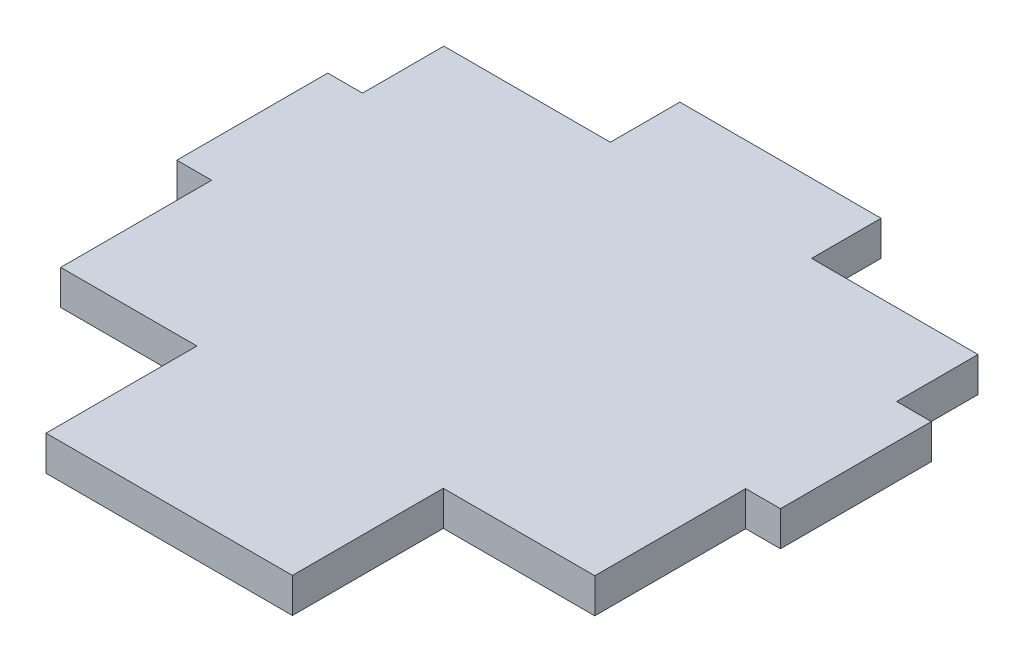
ISO-10303-21;
HEADER;
FILE_DESCRIPTION(('STEP AP214'),'2;1');
FILE_NAME('part.step','',(''),(''),'','','');
FILE_SCHEMA(('AUTOMOTIVE_DESIGN { 1 0 10303 214 1 1 1 1 }'));
ENDSEC;
DATA;
#1=APPLICATION_CONTEXT('core data for automotive mechanical design processes');
#2=APPLICATION_PROTOCOL_DEFINITION('international standard','automotive_design',2000,#1);
#3=PRODUCT_CONTEXT('',#1,'mechanical');
#4=PRODUCT('Part','Part','',(#3));
#5=PRODUCT_RELATED_PRODUCT_CATEGORY('part','',(#4));
#6=PRODUCT_DEFINITION_FORMATION('','',#4);
#7=PRODUCT_DEFINITION_CONTEXT('part definition',#1,'design');
#8=PRODUCT_DEFINITION('design','',#6,#7);
#9=PRODUCT_DEFINITION_SHAPE('','',#8);
#10=(LENGTH_UNIT() NAMED_UNIT(*) SI_UNIT(.MILLI.,.METRE.));
#11=(NAMED_UNIT(*) PLANE_ANGLE_UNIT() SI_UNIT($,.RADIAN.));
#12=(NAMED_UNIT(*) SI_UNIT($,.STERADIAN.) SOLID_ANGLE_UNIT());
#13=UNCERTAINTY_MEASURE_WITH_UNIT(LENGTH_MEASURE(1.E-05),#10,'distance_accuracy_value','');
#14=(GEOMETRIC_REPRESENTATION_CONTEXT(3) GLOBAL_UNCERTAINTY_ASSIGNED_CONTEXT((#13)) GLOBAL_UNIT_ASSIGNED_CONTEXT((#10,
#11,#12)) REPRESENTATION_CONTEXT('',''));
#15=CARTESIAN_POINT('',(0.,0.,0.));
#16=DIRECTION('',(0.,0.,1.));
#17=DIRECTION('',(1.,0.,0.));
#18=AXIS2_PLACEMENT_3D('',#15,#16,#17);
#19=CARTESIAN_POINT('',(50.8,5.85,38.1));
#20=DIRECTION('',(-1.,0.,0.));
#21=DIRECTION('',(0.,0.,1.));
#22=AXIS2_PLACEMENT_3D('',#19,#20,#21);
#23=PLANE('',#22);
#24=DIRECTION('',(0.,1.,0.));
#25=VECTOR('',#24,1.);
#26=CARTESIAN_POINT('',(50.8,5.84999999999999,-12.7));
#27=LINE('',#26,#25);
#28=CARTESIAN_POINT('',(50.8,0.,-12.7));
#29=VERTEX_POINT('',#28);
#30=CARTESIAN_POINT('',(50.8,5.84999999999999,-12.7));
#31=VERTEX_POINT('',#30);
#32=EDGE_CURVE('E267',#29,#31,#27,.T.);
#33=ORIENTED_EDGE('',*,*,#32,.T.);
#34=DIRECTION('',(0.,0.,-1.));
#35=VECTOR('',#34,1.);
#36=CARTESIAN_POINT('',(50.8,5.85,38.1));
#37=LINE('',#36,#35);
#38=CARTESIAN_POINT('',(50.8,5.84999999999999,12.7));
#39=VERTEX_POINT('',#38);
#40=EDGE_CURVE('E197',#39,#31,#37,.T.);
#41=ORIENTED_EDGE('',*,*,#40,.F.);
#42=DIRECTION('',(0.,-1.,0.));
#43=VECTOR('',#42,1.);
#44=CARTESIAN_POINT('',(50.8,5.84999999999999,12.7));
#45=LINE('',#44,#43);
#46=CARTESIAN_POINT('',(50.8,0.,12.7));
#47=VERTEX_POINT('',#46);
#48=EDGE_CURVE('E268',#39,#47,#45,.T.);
#49=ORIENTED_EDGE('',*,*,#48,.T.);
#50=DIRECTION('',(0.,0.,-1.));
#51=VECTOR('',#50,1.);
#52=CARTESIAN_POINT('',(50.8,0.,38.1));
#53=LINE('',#52,#51);
#54=EDGE_CURVE('E208',#47,#29,#53,.T.);
#55=ORIENTED_EDGE('',*,*,#54,.T.);
#56=EDGE_LOOP('',(#33,#41,#49,#55));
#57=FACE_BOUND('',#56,.T.);
#58=ADVANCED_FACE('F31',(#57),#23,.F.);
#59=CARTESIAN_POINT('',(-50.8,5.85,-38.1));
#60=DIRECTION('',(0.,0.,1.));
#61=DIRECTION('',(1.,0.,0.));
#62=AXIS2_PLACEMENT_3D('',#59,#60,#61);
#63=PLANE('',#62);
#64=DIRECTION('',(0.,1.,0.));
#65=VECTOR('',#64,1.);
#66=CARTESIAN_POINT('',(-16.9333333333333,5.85000000000001,-38.1));
#67=LINE('',#66,#65);
#68=CARTESIAN_POINT('',(-16.9333333333333,0.,-38.1));
#69=VERTEX_POINT('',#68);
#70=CARTESIAN_POINT('',(-16.9333333333333,5.85000000000001,-38.1));
#71=VERTEX_POINT('',#70);
#72=EDGE_CURVE('E182',#69,#71,#67,.T.);
#73=ORIENTED_EDGE('',*,*,#72,.T.);
#74=DIRECTION('',(-1.,0.,0.));
#75=VECTOR('',#74,1.);
#76=CARTESIAN_POINT('',(-50.8,5.85,-38.1));
#77=LINE('',#76,#75);
#78=CARTESIAN_POINT('',(16.9333333333333,5.85000000000001,-38.1));
#79=VERTEX_POINT('',#78);
#80=EDGE_CURVE('E188',#79,#71,#77,.T.);
#81=ORIENTED_EDGE('',*,*,#80,.F.);
#82=DIRECTION('',(0.,-1.,0.));
#83=VECTOR('',#82,1.);
#84=CARTESIAN_POINT('',(16.9333333333333,5.85000000000001,-38.1));
#85=LINE('',#84,#83);
#86=CARTESIAN_POINT('',(16.9333333333333,0.,-38.1));
#87=VERTEX_POINT('',#86);
#88=EDGE_CURVE('E170',#79,#87,#85,.T.);
#89=ORIENTED_EDGE('',*,*,#88,.T.);
#90=DIRECTION('',(-1.,0.,0.));
#91=VECTOR('',#90,1.);
#92=CARTESIAN_POINT('',(-50.8,0.,-38.1));
#93=LINE('',#92,#91);
#94=EDGE_CURVE('E260',#87,#69,#93,.T.);
#95=ORIENTED_EDGE('',*,*,#94,.T.);
#96=EDGE_LOOP('',(#73,#81,#89,#95));
#97=FACE_BOUND('',#96,.T.);
#98=ADVANCED_FACE('F195',(#97),#63,.F.);
#99=CARTESIAN_POINT('',(-50.8,5.85,38.1));
#100=DIRECTION('',(1.,0.,0.));
#101=DIRECTION('',(0.,0.,-1.));
#102=AXIS2_PLACEMENT_3D('',#99,#100,#101);
#103=PLANE('',#102);
#104=DIRECTION('',(0.,-1.,0.));
#105=VECTOR('',#104,1.);
#106=CARTESIAN_POINT('',(-50.8,-166.87,-12.7));
#107=LINE('',#106,#105);
#108=CARTESIAN_POINT('',(-50.8,5.84999999999999,-12.7));
#109=VERTEX_POINT('',#108);
#110=CARTESIAN_POINT('',(-50.8,0.,-12.7));
#111=VERTEX_POINT('',#110);
#112=EDGE_CURVE('E192',#109,#111,#107,.T.);
#113=ORIENTED_EDGE('',*,*,#112,.T.);
#114=DIRECTION('',(0.,0.,1.));
#115=VECTOR('',#114,1.);
#116=CARTESIAN_POINT('',(-50.8,0.,38.1));
#117=LINE('',#116,#115);
#118=CARTESIAN_POINT('',(-50.8,0.,12.7));
#119=VERTEX_POINT('',#118);
#120=EDGE_CURVE('E257',#111,#119,#117,.T.);
#121=ORIENTED_EDGE('',*,*,#120,.T.);
#122=DIRECTION('',(0.,1.,0.));
#123=VECTOR('',#122,1.);
#124=CARTESIAN_POINT('',(-50.8,-166.87,12.7));
#125=LINE('',#124,#123);
#126=CARTESIAN_POINT('',(-50.8,5.84999999999999,12.7));
#127=VERTEX_POINT('',#126);
#128=EDGE_CURVE('E315',#119,#127,#125,.T.);
#129=ORIENTED_EDGE('',*,*,#128,.T.);
#130=DIRECTION('',(0.,0.,1.));
#131=VECTOR('',#130,1.);
#132=CARTESIAN_POINT('',(-50.8,5.85,38.1));
#133=LINE('',#132,#131);
#134=EDGE_CURVE('E196',#109,#127,#133,.T.);
#135=ORIENTED_EDGE('',*,*,#134,.F.);
#136=EDGE_LOOP('',(#113,#121,#129,#135));
#137=FACE_BOUND('',#136,.T.);
#138=ADVANCED_FACE('F380',(#137),#103,.F.);
#139=CARTESIAN_POINT('',(-50.8,5.85,38.1));
#140=DIRECTION('',(0.,0.,-1.));
#141=DIRECTION('',(-1.,0.,0.));
#142=AXIS2_PLACEMENT_3D('',#139,#140,#141);
#143=PLANE('',#142);
#144=DIRECTION('',(0.,1.,0.));
#145=VECTOR('',#144,1.);
#146=CARTESIAN_POINT('',(-44.95,5.85,38.1));
#147=LINE('',#146,#145);
#148=CARTESIAN_POINT('',(-44.95,0.,38.1));
#149=VERTEX_POINT('',#148);
#150=CARTESIAN_POINT('',(-44.95,5.84999999999998,38.1));
#151=VERTEX_POINT('',#150);
#152=EDGE_CURVE('E221',#149,#151,#147,.T.);
#153=ORIENTED_EDGE('',*,*,#152,.F.);
#154=DIRECTION('',(1.,0.,0.));
#155=VECTOR('',#154,1.);
#156=CARTESIAN_POINT('',(-50.8,0.,38.1));
#157=LINE('',#156,#155);
#158=CARTESIAN_POINT('',(-22.0231196297328,0.,38.1));
#159=VERTEX_POINT('',#158);
#160=EDGE_CURVE('E203',#149,#159,#157,.T.);
#161=ORIENTED_EDGE('',*,*,#160,.T.);
#162=DIRECTION('',(0.,1.,0.));
#163=VECTOR('',#162,1.);
#164=CARTESIAN_POINT('',(-22.0231196297328,0.,38.1));
#165=LINE('',#164,#163);
#166=CARTESIAN_POINT('',(-22.0231196297328,5.85,38.1));
#167=VERTEX_POINT('',#166);
#168=EDGE_CURVE('E224',#159,#167,#165,.T.);
#169=ORIENTED_EDGE('',*,*,#168,.T.);
#170=DIRECTION('',(1.,0.,0.));
#171=VECTOR('',#170,1.);
#172=CARTESIAN_POINT('',(-50.8,5.85,38.1));
#173=LINE('',#172,#171);
#174=EDGE_CURVE('E34',#151,#167,#173,.T.);
#175=ORIENTED_EDGE('',*,*,#174,.F.);
#176=EDGE_LOOP('',(#153,#161,#169,#175));
#177=FACE_BOUND('',#176,.T.);
#178=ADVANCED_FACE('F384',(#177),#143,.F.);
#179=CARTESIAN_POINT('',(50.8,5.85,-38.1));
#180=DIRECTION('',(0.,-1.,0.));
#181=DIRECTION('',(0.,0.,-1.));
#182=AXIS2_PLACEMENT_3D('',#179,#180,#181);
#183=PLANE('',#182);
#184=DIRECTION('',(0.,0.,-1.));
#185=VECTOR('',#184,1.);
#186=CARTESIAN_POINT('',(-16.9333333333333,5.85000000000001,-22.25));
#187=LINE('',#186,#185);
#188=CARTESIAN_POINT('',(-16.9333333333333,5.85000000000001,-26.4));
#189=VERTEX_POINT('',#188);
#190=EDGE_CURVE('E320',#189,#71,#187,.T.);
#191=ORIENTED_EDGE('',*,*,#190,.F.);
#192=DIRECTION('',(1.,0.,0.));
#193=VECTOR('',#192,1.);
#194=CARTESIAN_POINT('',(50.8,5.85000000000001,-26.4));
#195=LINE('',#194,#193);
#196=CARTESIAN_POINT('',(-44.95,5.85000000000001,-26.4));
#197=VERTEX_POINT('',#196);
#198=EDGE_CURVE('E326',#197,#189,#195,.T.);
#199=ORIENTED_EDGE('',*,*,#198,.F.);
#200=DIRECTION('',(0.,0.,1.));
#201=VECTOR('',#200,1.);
#202=CARTESIAN_POINT('',(-44.95,5.84999999999998,38.1));
#203=LINE('',#202,#201);
#204=CARTESIAN_POINT('',(-44.95,5.84999999999999,-12.7));
#205=VERTEX_POINT('',#204);
#206=EDGE_CURVE('E312',#197,#205,#203,.T.);
#207=ORIENTED_EDGE('',*,*,#206,.T.);
#208=DIRECTION('',(1.,0.,0.));
#209=VECTOR('',#208,1.);
#210=CARTESIAN_POINT('',(-54.95,5.84999999999999,-12.7));
#211=LINE('',#210,#209);
#212=EDGE_CURVE('E302',#109,#205,#211,.T.);
#213=ORIENTED_EDGE('',*,*,#212,.F.);
#214=ORIENTED_EDGE('',*,*,#134,.T.);
#215=DIRECTION('',(1.,0.,0.));
#216=VECTOR('',#215,1.);
#217=CARTESIAN_POINT('',(-54.95,5.84999999999999,12.7));
#218=LINE('',#217,#216);
#219=CARTESIAN_POINT('',(-44.95,5.84999999999999,12.7));
#220=VERTEX_POINT('',#219);
#221=EDGE_CURVE('E301',#127,#220,#218,.T.);
#222=ORIENTED_EDGE('',*,*,#221,.T.);
#223=EDGE_CURVE('E304',#220,#151,#203,.T.);
#224=ORIENTED_EDGE('',*,*,#223,.T.);
#225=ORIENTED_EDGE('',*,*,#174,.T.);
#226=DIRECTION('',(0.,0.,1.));
#227=VECTOR('',#226,1.);
#228=CARTESIAN_POINT('',(-22.0231196297328,5.85,38.1));
#229=LINE('',#228,#227);
#230=CARTESIAN_POINT('',(-22.0231196297328,5.85,63.5));
#231=VERTEX_POINT('',#230);
#232=EDGE_CURVE('E217',#167,#231,#229,.T.);
#233=ORIENTED_EDGE('',*,*,#232,.T.);
#234=DIRECTION('',(1.,0.,0.));
#235=VECTOR('',#234,1.);
#236=CARTESIAN_POINT('',(-22.0231196297328,5.85,63.5));
#237=LINE('',#236,#235);
#238=CARTESIAN_POINT('',(19.4523274550558,5.85,63.5));
#239=VERTEX_POINT('',#238);
#240=EDGE_CURVE('E220',#231,#239,#237,.T.);
#241=ORIENTED_EDGE('',*,*,#240,.T.);
#242=DIRECTION('',(0.,0.,-1.));
#243=VECTOR('',#242,1.);
#244=CARTESIAN_POINT('',(19.4523274550558,5.85,38.1));
#245=LINE('',#244,#243);
#246=CARTESIAN_POINT('',(19.4523274550558,5.85,38.1));
#247=VERTEX_POINT('',#246);
#248=EDGE_CURVE('E247',#239,#247,#245,.T.);
#249=ORIENTED_EDGE('',*,*,#248,.T.);
#250=CARTESIAN_POINT('',(44.95,5.84999999999998,38.1));
#251=VERTEX_POINT('',#250);
#252=EDGE_CURVE('E200',#247,#251,#173,.T.);
#253=ORIENTED_EDGE('',*,*,#252,.T.);
#254=DIRECTION('',(0.,0.,1.));
#255=VECTOR('',#254,1.);
#256=CARTESIAN_POINT('',(44.95,5.84999999999998,38.1));
#257=LINE('',#256,#255);
#258=CARTESIAN_POINT('',(44.95,5.84999999999999,12.7));
#259=VERTEX_POINT('',#258);
#260=EDGE_CURVE('E284',#259,#251,#257,.T.);
#261=ORIENTED_EDGE('',*,*,#260,.F.);
#262=DIRECTION('',(1.,0.,0.));
#263=VECTOR('',#262,1.);
#264=CARTESIAN_POINT('',(40.8,5.84999999999999,12.7));
#265=LINE('',#264,#263);
#266=EDGE_CURVE('E286',#259,#39,#265,.T.);
#267=ORIENTED_EDGE('',*,*,#266,.T.);
#268=ORIENTED_EDGE('',*,*,#40,.T.);
#269=DIRECTION('',(1.,0.,0.));
#270=VECTOR('',#269,1.);
#271=CARTESIAN_POINT('',(40.8,5.84999999999999,-12.7));
#272=LINE('',#271,#270);
#273=CARTESIAN_POINT('',(44.95,5.84999999999999,-12.7));
#274=VERTEX_POINT('',#273);
#275=EDGE_CURVE('E282',#274,#31,#272,.T.);
#276=ORIENTED_EDGE('',*,*,#275,.F.);
#277=CARTESIAN_POINT('',(44.95,5.85000000000001,-26.4));
#278=VERTEX_POINT('',#277);
#279=EDGE_CURVE('E292',#278,#274,#257,.T.);
#280=ORIENTED_EDGE('',*,*,#279,.F.);
#281=CARTESIAN_POINT('',(16.9333333333333,5.85000000000001,-26.4));
#282=VERTEX_POINT('',#281);
#283=EDGE_CURVE('E191',#282,#278,#195,.T.);
#284=ORIENTED_EDGE('',*,*,#283,.F.);
#285=DIRECTION('',(0.,0.,-1.));
#286=VECTOR('',#285,1.);
#287=CARTESIAN_POINT('',(16.9333333333333,5.85000000000001,-22.25));
#288=LINE('',#287,#286);
#289=EDGE_CURVE('E174',#282,#79,#288,.T.);
#290=ORIENTED_EDGE('',*,*,#289,.T.);
#291=ORIENTED_EDGE('',*,*,#80,.T.);
#292=EDGE_LOOP('',(#191,#199,#207,#213,#214,#222,#224,#225,#233,#241,#249,#253,#261,#267,#268,
#276,#280,#284,#290,#291));
#293=FACE_BOUND('',#292,.T.);
#294=ADVANCED_FACE('F187',(#293),#183,.F.);
#295=CARTESIAN_POINT('',(50.8,0.,-38.1));
#296=DIRECTION('',(0.,-1.,0.));
#297=DIRECTION('',(0.,0.,-1.));
#298=AXIS2_PLACEMENT_3D('',#295,#296,#297);
#299=PLANE('',#298);
#300=DIRECTION('',(1.,0.,0.));
#301=VECTOR('',#300,1.);
#302=CARTESIAN_POINT('',(40.8,0.,12.7));
#303=LINE('',#302,#301);
#304=CARTESIAN_POINT('',(44.95,0.,12.7));
#305=VERTEX_POINT('',#304);
#306=EDGE_CURVE('E274',#305,#47,#303,.T.);
#307=ORIENTED_EDGE('',*,*,#306,.F.);
#308=DIRECTION('',(0.,0.,-1.));
#309=VECTOR('',#308,1.);
#310=CARTESIAN_POINT('',(44.95,0.,-38.1));
#311=LINE('',#310,#309);
#312=CARTESIAN_POINT('',(44.95,0.,38.1));
#313=VERTEX_POINT('',#312);
#314=EDGE_CURVE('E253',#313,#305,#311,.T.);
#315=ORIENTED_EDGE('',*,*,#314,.F.);
#316=CARTESIAN_POINT('',(19.4523274550558,0.,38.1));
#317=VERTEX_POINT('',#316);
#318=EDGE_CURVE('E215',#317,#313,#157,.T.);
#319=ORIENTED_EDGE('',*,*,#318,.F.);
#320=DIRECTION('',(0.,0.,-1.));
#321=VECTOR('',#320,1.);
#322=CARTESIAN_POINT('',(19.4523274550558,0.,38.1));
#323=LINE('',#322,#321);
#324=CARTESIAN_POINT('',(19.4523274550558,0.,63.5));
#325=VERTEX_POINT('',#324);
#326=EDGE_CURVE('E241',#325,#317,#323,.T.);
#327=ORIENTED_EDGE('',*,*,#326,.F.);
#328=DIRECTION('',(1.,0.,0.));
#329=VECTOR('',#328,1.);
#330=CARTESIAN_POINT('',(-22.0231196297328,0.,63.5));
#331=LINE('',#330,#329);
#332=CARTESIAN_POINT('',(-22.0231196297328,0.,63.5));
#333=VERTEX_POINT('',#332);
#334=EDGE_CURVE('E244',#333,#325,#331,.T.);
#335=ORIENTED_EDGE('',*,*,#334,.F.);
#336=DIRECTION('',(0.,0.,1.));
#337=VECTOR('',#336,1.);
#338=CARTESIAN_POINT('',(-22.0231196297328,0.,38.1));
#339=LINE('',#338,#337);
#340=EDGE_CURVE('E229',#159,#333,#339,.T.);
#341=ORIENTED_EDGE('',*,*,#340,.F.);
#342=ORIENTED_EDGE('',*,*,#160,.F.);
#343=DIRECTION('',(0.,0.,-1.));
#344=VECTOR('',#343,1.);
#345=CARTESIAN_POINT('',(-44.95,0.,-38.1));
#346=LINE('',#345,#344);
#347=CARTESIAN_POINT('',(-44.95,0.,12.7));
#348=VERTEX_POINT('',#347);
#349=EDGE_CURVE('E11',#149,#348,#346,.T.);
#350=ORIENTED_EDGE('',*,*,#349,.T.);
#351=DIRECTION('',(1.,0.,0.));
#352=VECTOR('',#351,1.);
#353=CARTESIAN_POINT('',(-54.95,0.,12.7));
#354=LINE('',#353,#352);
#355=EDGE_CURVE('E308',#119,#348,#354,.T.);
#356=ORIENTED_EDGE('',*,*,#355,.F.);
#357=ORIENTED_EDGE('',*,*,#120,.F.);
#358=DIRECTION('',(1.,0.,0.));
#359=VECTOR('',#358,1.);
#360=CARTESIAN_POINT('',(-54.95,0.,-12.7));
#361=LINE('',#360,#359);
#362=CARTESIAN_POINT('',(-44.95,0.,-12.7));
#363=VERTEX_POINT('',#362);
#364=EDGE_CURVE('E305',#111,#363,#361,.T.);
#365=ORIENTED_EDGE('',*,*,#364,.T.);
#366=CARTESIAN_POINT('',(-44.95,0.,-26.4));
#367=VERTEX_POINT('',#366);
#368=EDGE_CURVE('E41',#363,#367,#346,.T.);
#369=ORIENTED_EDGE('',*,*,#368,.T.);
#370=DIRECTION('',(-1.,0.,0.));
#371=VECTOR('',#370,1.);
#372=CARTESIAN_POINT('',(50.8,0.,-26.4));
#373=LINE('',#372,#371);
#374=CARTESIAN_POINT('',(-16.9333333333333,0.,-26.4));
#375=VERTEX_POINT('',#374);
#376=EDGE_CURVE('E40',#375,#367,#373,.T.);
#377=ORIENTED_EDGE('',*,*,#376,.F.);
#378=DIRECTION('',(0.,0.,-1.));
#379=VECTOR('',#378,1.);
#380=CARTESIAN_POINT('',(-16.9333333333333,0.,-22.25));
#381=LINE('',#380,#379);
#382=EDGE_CURVE('E322',#375,#69,#381,.T.);
#383=ORIENTED_EDGE('',*,*,#382,.T.);
#384=ORIENTED_EDGE('',*,*,#94,.F.);
#385=DIRECTION('',(0.,0.,-1.));
#386=VECTOR('',#385,1.);
#387=CARTESIAN_POINT('',(16.9333333333333,0.,-22.25));
#388=LINE('',#387,#386);
#389=CARTESIAN_POINT('',(16.9333333333333,0.,-26.4));
#390=VERTEX_POINT('',#389);
#391=EDGE_CURVE('E177',#390,#87,#388,.T.);
#392=ORIENTED_EDGE('',*,*,#391,.F.);
#393=CARTESIAN_POINT('',(44.95,0.,-26.4));
#394=VERTEX_POINT('',#393);
#395=EDGE_CURVE('E615',#394,#390,#373,.T.);
#396=ORIENTED_EDGE('',*,*,#395,.F.);
#397=CARTESIAN_POINT('',(44.95,0.,-12.7));
#398=VERTEX_POINT('',#397);
#399=EDGE_CURVE('E279',#398,#394,#311,.T.);
#400=ORIENTED_EDGE('',*,*,#399,.F.);
#401=DIRECTION('',(1.,0.,0.));
#402=VECTOR('',#401,1.);
#403=CARTESIAN_POINT('',(40.8,0.,-12.7));
#404=LINE('',#403,#402);
#405=EDGE_CURVE('E277',#398,#29,#404,.T.);
#406=ORIENTED_EDGE('',*,*,#405,.T.);
#407=ORIENTED_EDGE('',*,*,#54,.F.);
#408=EDGE_LOOP('',(#307,#315,#319,#327,#335,#341,#342,#350,#356,#357,#365,#369,#377,#383,#384,
#392,#396,#400,#406,#407));
#409=FACE_BOUND('',#408,.T.);
#410=ADVANCED_FACE('F272',(#409),#299,.T.);
#411=ORIENTED_EDGE('',*,*,#318,.T.);
#412=DIRECTION('',(0.,1.,0.));
#413=VECTOR('',#412,1.);
#414=CARTESIAN_POINT('',(44.95,5.85,38.1));
#415=LINE('',#414,#413);
#416=EDGE_CURVE('E337',#313,#251,#415,.T.);
#417=ORIENTED_EDGE('',*,*,#416,.T.);
#418=ORIENTED_EDGE('',*,*,#252,.F.);
#419=DIRECTION('',(0.,1.,0.));
#420=VECTOR('',#419,1.);
#421=CARTESIAN_POINT('',(19.4523274550558,0.,38.1));
#422=LINE('',#421,#420);
#423=EDGE_CURVE('E228',#317,#247,#422,.T.);
#424=ORIENTED_EDGE('',*,*,#423,.F.);
#425=EDGE_LOOP('',(#411,#417,#418,#424));
#426=FACE_BOUND('',#425,.T.);
#427=ADVANCED_FACE('F360',(#426),#143,.F.);
#428=CARTESIAN_POINT('',(-22.0231196297328,0.,38.1));
#429=DIRECTION('',(-1.,0.,0.));
#430=DIRECTION('',(0.,0.,1.));
#431=AXIS2_PLACEMENT_3D('',#428,#429,#430);
#432=PLANE('',#431);
#433=ORIENTED_EDGE('',*,*,#232,.F.);
#434=ORIENTED_EDGE('',*,*,#168,.F.);
#435=ORIENTED_EDGE('',*,*,#340,.T.);
#436=DIRECTION('',(0.,1.,0.));
#437=VECTOR('',#436,1.);
#438=CARTESIAN_POINT('',(-22.0231196297328,0.,63.5));
#439=LINE('',#438,#437);
#440=EDGE_CURVE('E243',#333,#231,#439,.T.);
#441=ORIENTED_EDGE('',*,*,#440,.T.);
#442=EDGE_LOOP('',(#433,#434,#435,#441));
#443=FACE_BOUND('',#442,.T.);
#444=ADVANCED_FACE('F348',(#443),#432,.T.);
#445=CARTESIAN_POINT('',(19.4523274550558,0.,38.1));
#446=DIRECTION('',(1.,0.,0.));
#447=DIRECTION('',(0.,0.,-1.));
#448=AXIS2_PLACEMENT_3D('',#445,#446,#447);
#449=PLANE('',#448);
#450=ORIENTED_EDGE('',*,*,#248,.F.);
#451=DIRECTION('',(0.,1.,0.));
#452=VECTOR('',#451,1.);
#453=CARTESIAN_POINT('',(19.4523274550558,0.,63.5));
#454=LINE('',#453,#452);
#455=EDGE_CURVE('E237',#325,#239,#454,.T.);
#456=ORIENTED_EDGE('',*,*,#455,.F.);
#457=ORIENTED_EDGE('',*,*,#326,.T.);
#458=ORIENTED_EDGE('',*,*,#423,.T.);
#459=EDGE_LOOP('',(#450,#456,#457,#458));
#460=FACE_BOUND('',#459,.T.);
#461=ADVANCED_FACE('F357',(#460),#449,.T.);
#462=CARTESIAN_POINT('',(-22.0231196297328,0.,63.5));
#463=DIRECTION('',(0.,0.,1.));
#464=DIRECTION('',(1.,0.,0.));
#465=AXIS2_PLACEMENT_3D('',#462,#463,#464);
#466=PLANE('',#465);
#467=ORIENTED_EDGE('',*,*,#240,.F.);
#468=ORIENTED_EDGE('',*,*,#440,.F.);
#469=ORIENTED_EDGE('',*,*,#334,.T.);
#470=ORIENTED_EDGE('',*,*,#455,.T.);
#471=EDGE_LOOP('',(#467,#468,#469,#470));
#472=FACE_BOUND('',#471,.T.);
#473=ADVANCED_FACE('F363',(#472),#466,.T.);
#474=CARTESIAN_POINT('',(40.8,5.84999999999999,12.7));
#475=DIRECTION('',(0.,0.,1.));
#476=DIRECTION('',(0.,-1.,0.));
#477=AXIS2_PLACEMENT_3D('',#474,#475,#476);
#478=PLANE('',#477);
#479=DIRECTION('',(0.,1.,0.));
#480=VECTOR('',#479,1.);
#481=CARTESIAN_POINT('',(44.95,-166.87,12.7));
#482=LINE('',#481,#480);
#483=EDGE_CURVE('E56',#305,#259,#482,.T.);
#484=ORIENTED_EDGE('',*,*,#483,.F.);
#485=ORIENTED_EDGE('',*,*,#306,.T.);
#486=ORIENTED_EDGE('',*,*,#48,.F.);
#487=ORIENTED_EDGE('',*,*,#266,.F.);
#488=EDGE_LOOP('',(#484,#485,#486,#487));
#489=FACE_BOUND('',#488,.T.);
#490=ADVANCED_FACE('F365',(#489),#478,.T.);
#491=CARTESIAN_POINT('',(44.95,-166.87,-38.1));
#492=DIRECTION('',(-1.,0.,0.));
#493=DIRECTION('',(0.,0.,-1.));
#494=AXIS2_PLACEMENT_3D('',#491,#492,#493);
#495=PLANE('',#494);
#496=ORIENTED_EDGE('',*,*,#314,.T.);
#497=ORIENTED_EDGE('',*,*,#483,.T.);
#498=ORIENTED_EDGE('',*,*,#260,.T.);
#499=ORIENTED_EDGE('',*,*,#416,.F.);
#500=EDGE_LOOP('',(#496,#497,#498,#499));
#501=FACE_BOUND('',#500,.T.);
#502=ADVANCED_FACE('F371',(#501),#495,.F.);
#503=CARTESIAN_POINT('',(16.9333333333333,5.85000000000001,-22.25));
#504=DIRECTION('',(1.,0.,0.));
#505=DIRECTION('',(0.,-1.,0.));
#506=AXIS2_PLACEMENT_3D('',#503,#504,#505);
#507=PLANE('',#506);
#508=DIRECTION('',(0.,1.,0.));
#509=VECTOR('',#508,1.);
#510=CARTESIAN_POINT('',(16.9333333333333,-166.87,-26.4));
#511=LINE('',#510,#509);
#512=EDGE_CURVE('E328',#390,#282,#511,.T.);
#513=ORIENTED_EDGE('',*,*,#512,.F.);
#514=ORIENTED_EDGE('',*,*,#391,.T.);
#515=ORIENTED_EDGE('',*,*,#88,.F.);
#516=ORIENTED_EDGE('',*,*,#289,.F.);
#517=EDGE_LOOP('',(#513,#514,#515,#516));
#518=FACE_BOUND('',#517,.T.);
#519=ADVANCED_FACE('F173',(#518),#507,.T.);
#520=CARTESIAN_POINT('',(40.8,5.84999999999999,-12.7));
#521=DIRECTION('',(0.,0.,-1.));
#522=DIRECTION('',(0.,1.,0.));
#523=AXIS2_PLACEMENT_3D('',#520,#521,#522);
#524=PLANE('',#523);
#525=DIRECTION('',(0.,-1.,0.));
#526=VECTOR('',#525,1.);
#527=CARTESIAN_POINT('',(44.95,-166.87,-12.7));
#528=LINE('',#527,#526);
#529=EDGE_CURVE('E295',#274,#398,#528,.T.);
#530=ORIENTED_EDGE('',*,*,#529,.F.);
#531=ORIENTED_EDGE('',*,*,#275,.T.);
#532=ORIENTED_EDGE('',*,*,#32,.F.);
#533=ORIENTED_EDGE('',*,*,#405,.F.);
#534=EDGE_LOOP('',(#530,#531,#532,#533));
#535=FACE_BOUND('',#534,.T.);
#536=ADVANCED_FACE('F484',(#535),#524,.T.);
#537=ORIENTED_EDGE('',*,*,#399,.T.);
#538=DIRECTION('',(0.,-1.,0.));
#539=VECTOR('',#538,1.);
#540=CARTESIAN_POINT('',(44.95,-166.87,-26.4));
#541=LINE('',#540,#539);
#542=EDGE_CURVE('E332',#278,#394,#541,.T.);
#543=ORIENTED_EDGE('',*,*,#542,.F.);
#544=ORIENTED_EDGE('',*,*,#279,.T.);
#545=ORIENTED_EDGE('',*,*,#529,.T.);
#546=EDGE_LOOP('',(#537,#543,#544,#545));
#547=FACE_BOUND('',#546,.T.);
#548=ADVANCED_FACE('F469',(#547),#495,.F.);
#549=CARTESIAN_POINT('',(-50.8,-166.87,-26.4));
#550=DIRECTION('',(0.,0.,1.));
#551=DIRECTION('',(-1.,0.,0.));
#552=AXIS2_PLACEMENT_3D('',#549,#550,#551);
#553=PLANE('',#552);
#554=ORIENTED_EDGE('',*,*,#395,.T.);
#555=ORIENTED_EDGE('',*,*,#512,.T.);
#556=ORIENTED_EDGE('',*,*,#283,.T.);
#557=ORIENTED_EDGE('',*,*,#542,.T.);
#558=EDGE_LOOP('',(#554,#555,#556,#557));
#559=FACE_BOUND('',#558,.T.);
#560=ADVANCED_FACE('F504',(#559),#553,.F.);
#561=CARTESIAN_POINT('',(-54.95,5.84999999999999,12.7));
#562=DIRECTION('',(0.,0.,1.));
#563=DIRECTION('',(0.,-1.,0.));
#564=AXIS2_PLACEMENT_3D('',#561,#562,#563);
#565=PLANE('',#564);
#566=ORIENTED_EDGE('',*,*,#128,.F.);
#567=ORIENTED_EDGE('',*,*,#355,.T.);
#568=DIRECTION('',(0.,-1.,0.));
#569=VECTOR('',#568,1.);
#570=CARTESIAN_POINT('',(-44.95,5.84999999999999,12.7));
#571=LINE('',#570,#569);
#572=EDGE_CURVE('E297',#220,#348,#571,.T.);
#573=ORIENTED_EDGE('',*,*,#572,.F.);
#574=ORIENTED_EDGE('',*,*,#221,.F.);
#575=EDGE_LOOP('',(#566,#567,#573,#574));
#576=FACE_BOUND('',#575,.T.);
#577=ADVANCED_FACE('F521',(#576),#565,.T.);
#578=CARTESIAN_POINT('',(-44.95,-166.87,-38.1));
#579=DIRECTION('',(-1.,0.,0.));
#580=DIRECTION('',(0.,0.,-1.));
#581=AXIS2_PLACEMENT_3D('',#578,#579,#580);
#582=PLANE('',#581);
#583=ORIENTED_EDGE('',*,*,#152,.T.);
#584=ORIENTED_EDGE('',*,*,#223,.F.);
#585=ORIENTED_EDGE('',*,*,#572,.T.);
#586=ORIENTED_EDGE('',*,*,#349,.F.);
#587=EDGE_LOOP('',(#583,#584,#585,#586));
#588=FACE_BOUND('',#587,.T.);
#589=ADVANCED_FACE('F533',(#588),#582,.T.);
#590=ORIENTED_EDGE('',*,*,#376,.T.);
#591=DIRECTION('',(0.,1.,0.));
#592=VECTOR('',#591,1.);
#593=CARTESIAN_POINT('',(-44.95,-166.87,-26.4));
#594=LINE('',#593,#592);
#595=EDGE_CURVE('E335',#367,#197,#594,.T.);
#596=ORIENTED_EDGE('',*,*,#595,.T.);
#597=ORIENTED_EDGE('',*,*,#198,.T.);
#598=DIRECTION('',(0.,-1.,0.));
#599=VECTOR('',#598,1.);
#600=CARTESIAN_POINT('',(-16.9333333333333,-166.87,-26.4));
#601=LINE('',#600,#599);
#602=EDGE_CURVE('E330',#189,#375,#601,.T.);
#603=ORIENTED_EDGE('',*,*,#602,.T.);
#604=EDGE_LOOP('',(#590,#596,#597,#603));
#605=FACE_BOUND('',#604,.T.);
#606=ADVANCED_FACE('F524',(#605),#553,.F.);
#607=CARTESIAN_POINT('',(-16.9333333333333,5.85000000000001,-22.25));
#608=DIRECTION('',(-1.,0.,0.));
#609=DIRECTION('',(0.,1.,0.));
#610=AXIS2_PLACEMENT_3D('',#607,#608,#609);
#611=PLANE('',#610);
#612=ORIENTED_EDGE('',*,*,#602,.F.);
#613=ORIENTED_EDGE('',*,*,#190,.T.);
#614=ORIENTED_EDGE('',*,*,#72,.F.);
#615=ORIENTED_EDGE('',*,*,#382,.F.);
#616=EDGE_LOOP('',(#612,#613,#614,#615));
#617=FACE_BOUND('',#616,.T.);
#618=ADVANCED_FACE('F559',(#617),#611,.T.);
#619=DIRECTION('',(0.,1.,0.));
#620=VECTOR('',#619,1.);
#621=CARTESIAN_POINT('',(-44.95,5.84999999999999,-12.7));
#622=LINE('',#621,#620);
#623=EDGE_CURVE('E48',#363,#205,#622,.T.);
#624=ORIENTED_EDGE('',*,*,#623,.T.);
#625=ORIENTED_EDGE('',*,*,#206,.F.);
#626=ORIENTED_EDGE('',*,*,#595,.F.);
#627=ORIENTED_EDGE('',*,*,#368,.F.);
#628=EDGE_LOOP('',(#624,#625,#626,#627));
#629=FACE_BOUND('',#628,.T.);
#630=ADVANCED_FACE('F544',(#629),#582,.T.);
#631=CARTESIAN_POINT('',(-54.95,5.84999999999999,-12.7));
#632=DIRECTION('',(0.,0.,-1.));
#633=DIRECTION('',(0.,1.,0.));
#634=AXIS2_PLACEMENT_3D('',#631,#632,#633);
#635=PLANE('',#634);
#636=ORIENTED_EDGE('',*,*,#112,.F.);
#637=ORIENTED_EDGE('',*,*,#212,.T.);
#638=ORIENTED_EDGE('',*,*,#623,.F.);
#639=ORIENTED_EDGE('',*,*,#364,.F.);
#640=EDGE_LOOP('',(#636,#637,#638,#639));
#641=FACE_BOUND('',#640,.T.);
#642=ADVANCED_FACE('F579',(#641),#635,.T.);
#643=CLOSED_SHELL('',(#58,#98,#138,#178,#294,#410,#427,#444,#461,#473,#490,#502,#519,#536,#548,
#560,#577,#589,#606,#618,#630,#642));
#644=MANIFOLD_SOLID_BREP('B2',#643);
#645=ADVANCED_BREP_SHAPE_REPRESENTATION('',(#18,#644),#14);
#646=SHAPE_DEFINITION_REPRESENTATION(#9,#645);
ENDSEC;
END-ISO-10303-21;
